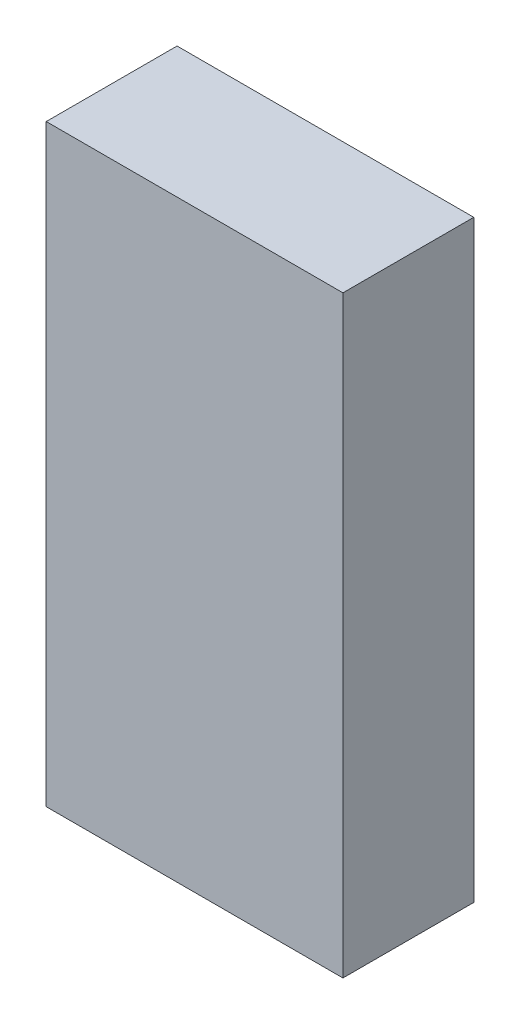
ISO-10303-21;
HEADER;
FILE_DESCRIPTION(('STEP AP214'),'2;1');
FILE_NAME('part.step','',(''),(''),'','','');
FILE_SCHEMA(('AUTOMOTIVE_DESIGN { 1 0 10303 214 1 1 1 1 }'));
ENDSEC;
DATA;
#1=APPLICATION_CONTEXT('core data for automotive mechanical design processes');
#2=APPLICATION_PROTOCOL_DEFINITION('international standard','automotive_design',2000,#1);
#3=PRODUCT_CONTEXT('',#1,'mechanical');
#4=PRODUCT('Part','Part','',(#3));
#5=PRODUCT_RELATED_PRODUCT_CATEGORY('part','',(#4));
#6=PRODUCT_DEFINITION_FORMATION('','',#4);
#7=PRODUCT_DEFINITION_CONTEXT('part definition',#1,'design');
#8=PRODUCT_DEFINITION('design','',#6,#7);
#9=PRODUCT_DEFINITION_SHAPE('','',#8);
#10=(LENGTH_UNIT() NAMED_UNIT(*) SI_UNIT(.MILLI.,.METRE.));
#11=(NAMED_UNIT(*) PLANE_ANGLE_UNIT() SI_UNIT($,.RADIAN.));
#12=(NAMED_UNIT(*) SI_UNIT($,.STERADIAN.) SOLID_ANGLE_UNIT());
#13=UNCERTAINTY_MEASURE_WITH_UNIT(LENGTH_MEASURE(1.E-05),#10,'distance_accuracy_value','');
#14=(GEOMETRIC_REPRESENTATION_CONTEXT(3) GLOBAL_UNCERTAINTY_ASSIGNED_CONTEXT((#13)) GLOBAL_UNIT_ASSIGNED_CONTEXT((#10,
#11,#12)) REPRESENTATION_CONTEXT('',''));
#15=CARTESIAN_POINT('',(0.,0.,0.));
#16=DIRECTION('',(0.,0.,1.));
#17=DIRECTION('',(1.,0.,0.));
#18=AXIS2_PLACEMENT_3D('',#15,#16,#17);
#19=CARTESIAN_POINT('',(0.,0.,11.20000046));
#20=DIRECTION('',(0.,0.,-1.));
#21=DIRECTION('',(-1.,0.,0.));
#22=AXIS2_PLACEMENT_3D('',#19,#20,#21);
#23=PLANE('',#22);
#24=DIRECTION('',(0.,1.,0.));
#25=VECTOR('',#24,1.);
#26=CARTESIAN_POINT('',(-12.7,-25.4,11.20000046));
#27=LINE('',#26,#25);
#28=CARTESIAN_POINT('',(-12.7,-25.4,11.20000046));
#29=VERTEX_POINT('',#28);
#30=CARTESIAN_POINT('',(-12.7,25.4,11.20000046));
#31=VERTEX_POINT('',#30);
#32=EDGE_CURVE('E68',#29,#31,#27,.T.);
#33=ORIENTED_EDGE('',*,*,#32,.F.);
#34=DIRECTION('',(1.,0.,0.));
#35=VECTOR('',#34,1.);
#36=CARTESIAN_POINT('',(12.7,-25.4,11.20000046));
#37=LINE('',#36,#35);
#38=CARTESIAN_POINT('',(12.7,-25.4,11.20000046));
#39=VERTEX_POINT('',#38);
#40=EDGE_CURVE('E55',#39,#29,#37,.F.);
#41=ORIENTED_EDGE('',*,*,#40,.F.);
#42=DIRECTION('',(0.,1.,0.));
#43=VECTOR('',#42,1.);
#44=CARTESIAN_POINT('',(12.7,25.4,11.20000046));
#45=LINE('',#44,#43);
#46=CARTESIAN_POINT('',(12.7,25.4,11.20000046));
#47=VERTEX_POINT('',#46);
#48=EDGE_CURVE('E20',#47,#39,#45,.F.);
#49=ORIENTED_EDGE('',*,*,#48,.F.);
#50=DIRECTION('',(1.,0.,0.));
#51=VECTOR('',#50,1.);
#52=CARTESIAN_POINT('',(-12.7,25.4,11.20000046));
#53=LINE('',#52,#51);
#54=EDGE_CURVE('E80',#31,#47,#53,.T.);
#55=ORIENTED_EDGE('',*,*,#54,.F.);
#56=EDGE_LOOP('',(#33,#41,#49,#55));
#57=FACE_BOUND('',#56,.T.);
#58=ADVANCED_FACE('F17',(#57),#23,.F.);
#59=CARTESIAN_POINT('',(12.7,25.4,0.));
#60=DIRECTION('',(1.,0.,0.));
#61=DIRECTION('',(0.,0.,-1.));
#62=AXIS2_PLACEMENT_3D('',#59,#60,#61);
#63=PLANE('',#62);
#64=DIRECTION('',(0.,0.,-1.));
#65=VECTOR('',#64,1.);
#66=CARTESIAN_POINT('',(12.7,-25.4,0.));
#67=LINE('',#66,#65);
#68=CARTESIAN_POINT('',(12.7,-25.4,0.));
#69=VERTEX_POINT('',#68);
#70=EDGE_CURVE('E61',#69,#39,#67,.F.);
#71=ORIENTED_EDGE('',*,*,#70,.F.);
#72=DIRECTION('',(0.,1.,0.));
#73=VECTOR('',#72,1.);
#74=CARTESIAN_POINT('',(12.7,0.,0.));
#75=LINE('',#74,#73);
#76=CARTESIAN_POINT('',(12.7,25.4,0.));
#77=VERTEX_POINT('',#76);
#78=EDGE_CURVE('E83',#77,#69,#75,.F.);
#79=ORIENTED_EDGE('',*,*,#78,.F.);
#80=DIRECTION('',(0.,0.,1.));
#81=VECTOR('',#80,1.);
#82=CARTESIAN_POINT('',(12.7,25.4,0.));
#83=LINE('',#82,#81);
#84=EDGE_CURVE('E64',#47,#77,#83,.F.);
#85=ORIENTED_EDGE('',*,*,#84,.F.);
#86=ORIENTED_EDGE('',*,*,#48,.T.);
#87=EDGE_LOOP('',(#71,#79,#85,#86));
#88=FACE_BOUND('',#87,.T.);
#89=ADVANCED_FACE('F60',(#88),#63,.T.);
#90=CARTESIAN_POINT('',(12.7,-25.4,0.));
#91=DIRECTION('',(0.,-1.,0.));
#92=DIRECTION('',(0.,0.,-1.));
#93=AXIS2_PLACEMENT_3D('',#90,#91,#92);
#94=PLANE('',#93);
#95=DIRECTION('',(0.,0.,1.));
#96=VECTOR('',#95,1.);
#97=CARTESIAN_POINT('',(-12.7,-25.4,0.));
#98=LINE('',#97,#96);
#99=CARTESIAN_POINT('',(-12.7,-25.4,0.));
#100=VERTEX_POINT('',#99);
#101=EDGE_CURVE('E70',#100,#29,#98,.T.);
#102=ORIENTED_EDGE('',*,*,#101,.F.);
#103=DIRECTION('',(-1.,0.,0.));
#104=VECTOR('',#103,1.);
#105=CARTESIAN_POINT('',(0.,-25.4,0.));
#106=LINE('',#105,#104);
#107=EDGE_CURVE('E74',#69,#100,#106,.T.);
#108=ORIENTED_EDGE('',*,*,#107,.F.);
#109=ORIENTED_EDGE('',*,*,#70,.T.);
#110=ORIENTED_EDGE('',*,*,#40,.T.);
#111=EDGE_LOOP('',(#102,#108,#109,#110));
#112=FACE_BOUND('',#111,.T.);
#113=ADVANCED_FACE('F72',(#112),#94,.T.);
#114=CARTESIAN_POINT('',(-12.7,-25.4,0.));
#115=DIRECTION('',(-1.,0.,0.));
#116=DIRECTION('',(0.,0.,1.));
#117=AXIS2_PLACEMENT_3D('',#114,#115,#116);
#118=PLANE('',#117);
#119=DIRECTION('',(0.,0.,1.));
#120=VECTOR('',#119,1.);
#121=CARTESIAN_POINT('',(-12.7,25.4,0.));
#122=LINE('',#121,#120);
#123=CARTESIAN_POINT('',(-12.7,25.4,0.));
#124=VERTEX_POINT('',#123);
#125=EDGE_CURVE('E35',#124,#31,#122,.T.);
#126=ORIENTED_EDGE('',*,*,#125,.F.);
#127=DIRECTION('',(0.,1.,0.));
#128=VECTOR('',#127,1.);
#129=CARTESIAN_POINT('',(-12.7,0.,0.));
#130=LINE('',#129,#128);
#131=EDGE_CURVE('E26',#100,#124,#130,.T.);
#132=ORIENTED_EDGE('',*,*,#131,.F.);
#133=ORIENTED_EDGE('',*,*,#101,.T.);
#134=ORIENTED_EDGE('',*,*,#32,.T.);
#135=EDGE_LOOP('',(#126,#132,#133,#134));
#136=FACE_BOUND('',#135,.T.);
#137=ADVANCED_FACE('F89',(#136),#118,.T.);
#138=CARTESIAN_POINT('',(-12.7,25.4,0.));
#139=DIRECTION('',(0.,1.,0.));
#140=DIRECTION('',(0.,0.,1.));
#141=AXIS2_PLACEMENT_3D('',#138,#139,#140);
#142=PLANE('',#141);
#143=ORIENTED_EDGE('',*,*,#84,.T.);
#144=DIRECTION('',(-1.,0.,0.));
#145=VECTOR('',#144,1.);
#146=CARTESIAN_POINT('',(0.,25.4,0.));
#147=LINE('',#146,#145);
#148=EDGE_CURVE('E11',#124,#77,#147,.F.);
#149=ORIENTED_EDGE('',*,*,#148,.F.);
#150=ORIENTED_EDGE('',*,*,#125,.T.);
#151=ORIENTED_EDGE('',*,*,#54,.T.);
#152=EDGE_LOOP('',(#143,#149,#150,#151));
#153=FACE_BOUND('',#152,.T.);
#154=ADVANCED_FACE('F91',(#153),#142,.T.);
#155=CARTESIAN_POINT('',(0.,0.,0.));
#156=DIRECTION('',(0.,0.,-1.));
#157=DIRECTION('',(-1.,0.,0.));
#158=AXIS2_PLACEMENT_3D('',#155,#156,#157);
#159=PLANE('',#158);
#160=ORIENTED_EDGE('',*,*,#131,.T.);
#161=ORIENTED_EDGE('',*,*,#148,.T.);
#162=ORIENTED_EDGE('',*,*,#78,.T.);
#163=ORIENTED_EDGE('',*,*,#107,.T.);
#164=EDGE_LOOP('',(#160,#161,#162,#163));
#165=FACE_BOUND('',#164,.T.);
#166=ADVANCED_FACE('F88',(#165),#159,.T.);
#167=CLOSED_SHELL('',(#58,#89,#113,#137,#154,#166));
#168=MANIFOLD_SOLID_BREP('B1',#167);
#169=ADVANCED_BREP_SHAPE_REPRESENTATION('',(#18,#168),#14);
#170=SHAPE_DEFINITION_REPRESENTATION(#9,#169);
ENDSEC;
END-ISO-10303-21;
